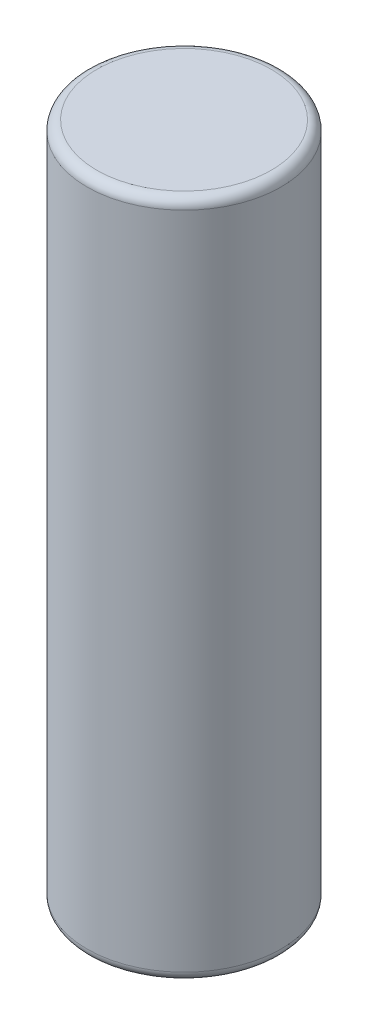
ISO-10303-21;
HEADER;
FILE_DESCRIPTION(('STEP AP214'),'2;1');
FILE_NAME('part.step','',(''),(''),'','','');
FILE_SCHEMA(('AUTOMOTIVE_DESIGN { 1 0 10303 214 1 1 1 1 }'));
ENDSEC;
DATA;
#1=APPLICATION_CONTEXT('core data for automotive mechanical design processes');
#2=APPLICATION_PROTOCOL_DEFINITION('international standard','automotive_design',2000,#1);
#3=PRODUCT_CONTEXT('',#1,'mechanical');
#4=PRODUCT('Part','Part','',(#3));
#5=PRODUCT_RELATED_PRODUCT_CATEGORY('part','',(#4));
#6=PRODUCT_DEFINITION_FORMATION('','',#4);
#7=PRODUCT_DEFINITION_CONTEXT('part definition',#1,'design');
#8=PRODUCT_DEFINITION('design','',#6,#7);
#9=PRODUCT_DEFINITION_SHAPE('','',#8);
#10=(LENGTH_UNIT() NAMED_UNIT(*) SI_UNIT(.MILLI.,.METRE.));
#11=(NAMED_UNIT(*) PLANE_ANGLE_UNIT() SI_UNIT($,.RADIAN.));
#12=(NAMED_UNIT(*) SI_UNIT($,.STERADIAN.) SOLID_ANGLE_UNIT());
#13=UNCERTAINTY_MEASURE_WITH_UNIT(LENGTH_MEASURE(1.E-05),#10,'distance_accuracy_value','');
#14=(GEOMETRIC_REPRESENTATION_CONTEXT(3) GLOBAL_UNCERTAINTY_ASSIGNED_CONTEXT((#13)) GLOBAL_UNIT_ASSIGNED_CONTEXT((#10,
#11,#12)) REPRESENTATION_CONTEXT('',''));
#15=CARTESIAN_POINT('',(0.,0.,0.));
#16=DIRECTION('',(0.,0.,1.));
#17=DIRECTION('',(1.,0.,0.));
#18=AXIS2_PLACEMENT_3D('',#15,#16,#17);
#19=CARTESIAN_POINT('',(0.,7.,0.));
#20=DIRECTION('',(0.,-1.,0.));
#21=DIRECTION('',(0.,0.,-1.));
#22=AXIS2_PLACEMENT_3D('',#19,#20,#21);
#23=CYLINDRICAL_SURFACE('',#22,1.);
#24=CARTESIAN_POINT('',(0.,0.1,0.));
#25=DIRECTION('',(0.,1.,0.));
#26=DIRECTION('',(0.,0.,1.));
#27=AXIS2_PLACEMENT_3D('',#24,#25,#26);
#28=CIRCLE('',#27,1.);
#29=CARTESIAN_POINT('',(0.,0.1,1.));
#30=VERTEX_POINT('',#29);
#31=EDGE_CURVE('E46',#30,#30,#28,.T.);
#32=ORIENTED_EDGE('',*,*,#31,.T.);
#33=EDGE_LOOP('',(#32));
#34=FACE_BOUND('',#33,.T.);
#35=CARTESIAN_POINT('',(0.,6.9,0.));
#36=DIRECTION('',(0.,1.,0.));
#37=DIRECTION('',(0.,0.,1.));
#38=AXIS2_PLACEMENT_3D('',#35,#36,#37);
#39=CIRCLE('',#38,1.);
#40=CARTESIAN_POINT('',(0.,6.9,1.));
#41=VERTEX_POINT('',#40);
#42=EDGE_CURVE('E50',#41,#41,#39,.F.);
#43=ORIENTED_EDGE('',*,*,#42,.T.);
#44=EDGE_LOOP('',(#43));
#45=FACE_BOUND('',#44,.T.);
#46=ADVANCED_FACE('F35',(#34,#45),#23,.T.);
#47=CARTESIAN_POINT('',(0.,7.,0.));
#48=DIRECTION('',(0.,1.,0.));
#49=DIRECTION('',(0.,0.,1.));
#50=AXIS2_PLACEMENT_3D('',#47,#48,#49);
#51=PLANE('',#50);
#52=CARTESIAN_POINT('',(0.,7.,0.));
#53=DIRECTION('',(0.,1.,0.));
#54=DIRECTION('',(0.,0.,1.));
#55=AXIS2_PLACEMENT_3D('',#52,#53,#54);
#56=CIRCLE('',#55,0.9);
#57=CARTESIAN_POINT('',(0.,7.,0.9));
#58=VERTEX_POINT('',#57);
#59=EDGE_CURVE('E10',#58,#58,#56,.T.);
#60=ORIENTED_EDGE('',*,*,#59,.T.);
#61=EDGE_LOOP('',(#60));
#62=FACE_BOUND('',#61,.T.);
#63=ADVANCED_FACE('F66',(#62),#51,.T.);
#64=CARTESIAN_POINT('',(0.,0.,0.));
#65=DIRECTION('',(0.,1.,0.));
#66=DIRECTION('',(0.,0.,1.));
#67=AXIS2_PLACEMENT_3D('',#64,#65,#66);
#68=PLANE('',#67);
#69=CARTESIAN_POINT('',(0.,0.,0.));
#70=DIRECTION('',(0.,1.,0.));
#71=DIRECTION('',(0.,0.,1.));
#72=AXIS2_PLACEMENT_3D('',#69,#70,#71);
#73=CIRCLE('',#72,0.9);
#74=CARTESIAN_POINT('',(0.,0.,0.9));
#75=VERTEX_POINT('',#74);
#76=EDGE_CURVE('E42',#75,#75,#73,.F.);
#77=ORIENTED_EDGE('',*,*,#76,.T.);
#78=EDGE_LOOP('',(#77));
#79=FACE_BOUND('',#78,.T.);
#80=ADVANCED_FACE('F63',(#79),#68,.F.);
#81=CARTESIAN_POINT('',(0.,0.1,0.));
#82=DIRECTION('',(0.,1.,0.));
#83=DIRECTION('',(0.,0.,1.));
#84=AXIS2_PLACEMENT_3D('',#81,#82,#83);
#85=TOROIDAL_SURFACE('',#84,0.9,0.1);
#86=ORIENTED_EDGE('',*,*,#76,.F.);
#87=EDGE_LOOP('',(#86));
#88=FACE_BOUND('',#87,.T.);
#89=ORIENTED_EDGE('',*,*,#31,.F.);
#90=EDGE_LOOP('',(#89));
#91=FACE_BOUND('',#90,.T.);
#92=ADVANCED_FACE('F59',(#88,#91),#85,.T.);
#93=CARTESIAN_POINT('',(0.,6.9,0.));
#94=DIRECTION('',(0.,1.,0.));
#95=DIRECTION('',(0.,0.,1.));
#96=AXIS2_PLACEMENT_3D('',#93,#94,#95);
#97=TOROIDAL_SURFACE('',#96,0.9,0.1);
#98=ORIENTED_EDGE('',*,*,#42,.F.);
#99=EDGE_LOOP('',(#98));
#100=FACE_BOUND('',#99,.T.);
#101=ORIENTED_EDGE('',*,*,#59,.F.);
#102=EDGE_LOOP('',(#101));
#103=FACE_BOUND('',#102,.T.);
#104=ADVANCED_FACE('F37',(#100,#103),#97,.T.);
#105=CLOSED_SHELL('',(#46,#63,#80,#92,#104));
#106=MANIFOLD_SOLID_BREP('B2',#105);
#107=ADVANCED_BREP_SHAPE_REPRESENTATION('',(#18,#106),#14);
#108=SHAPE_DEFINITION_REPRESENTATION(#9,#107);
ENDSEC;
END-ISO-10303-21;
